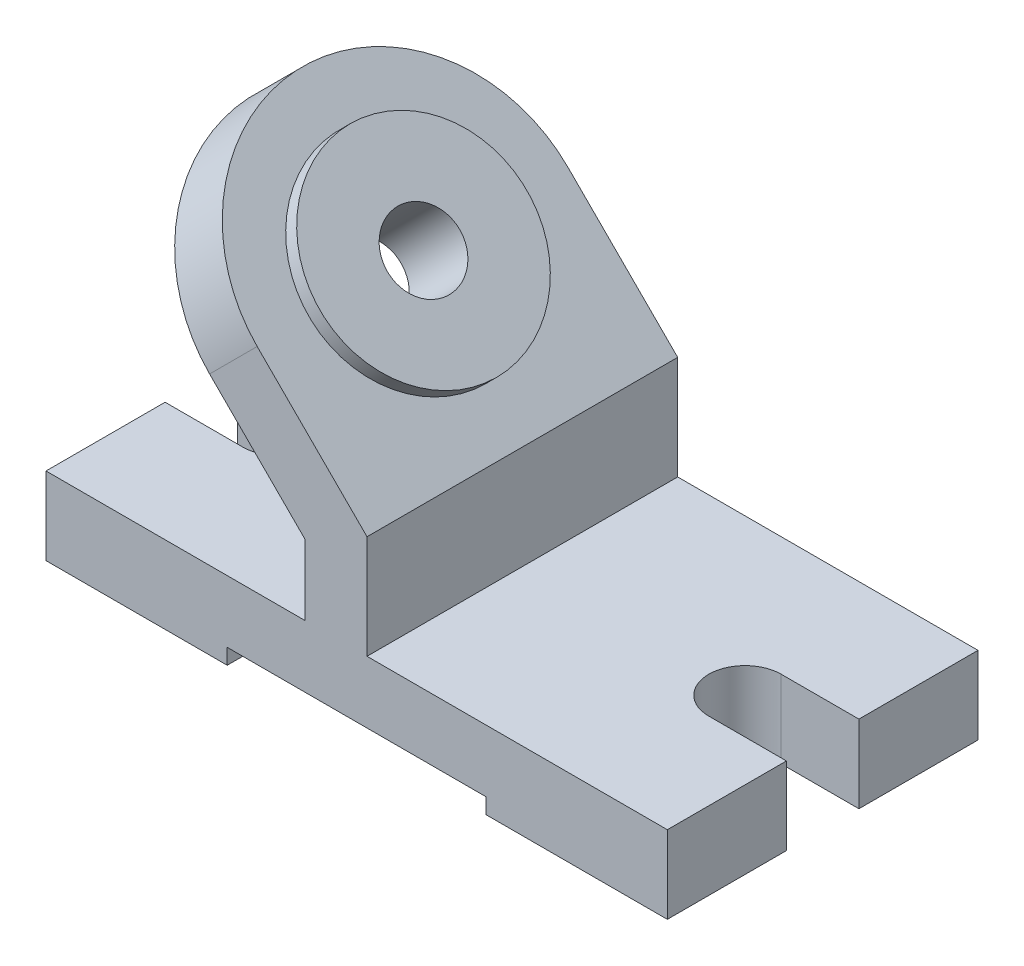
ISO-10303-21;
HEADER;
FILE_DESCRIPTION(('STEP AP214'),'2;1');
FILE_NAME('part.step','',(''),(''),'','','');
FILE_SCHEMA(('AUTOMOTIVE_DESIGN { 1 0 10303 214 1 1 1 1 }'));
ENDSEC;
DATA;
#1=APPLICATION_CONTEXT('core data for automotive mechanical design processes');
#2=APPLICATION_PROTOCOL_DEFINITION('international standard','automotive_design',2000,#1);
#3=PRODUCT_CONTEXT('',#1,'mechanical');
#4=PRODUCT('Part','Part','',(#3));
#5=PRODUCT_RELATED_PRODUCT_CATEGORY('part','',(#4));
#6=PRODUCT_DEFINITION_FORMATION('','',#4);
#7=PRODUCT_DEFINITION_CONTEXT('part definition',#1,'design');
#8=PRODUCT_DEFINITION('design','',#6,#7);
#9=PRODUCT_DEFINITION_SHAPE('','',#8);
#10=(LENGTH_UNIT() NAMED_UNIT(*) SI_UNIT(.MILLI.,.METRE.));
#11=(NAMED_UNIT(*) PLANE_ANGLE_UNIT() SI_UNIT($,.RADIAN.));
#12=(NAMED_UNIT(*) SI_UNIT($,.STERADIAN.) SOLID_ANGLE_UNIT());
#13=UNCERTAINTY_MEASURE_WITH_UNIT(LENGTH_MEASURE(1.E-05),#10,'distance_accuracy_value','');
#14=(GEOMETRIC_REPRESENTATION_CONTEXT(3) GLOBAL_UNCERTAINTY_ASSIGNED_CONTEXT((#13)) GLOBAL_UNIT_ASSIGNED_CONTEXT((#10,
#11,#12)) REPRESENTATION_CONTEXT('',''));
#15=CARTESIAN_POINT('',(0.,0.,0.));
#16=DIRECTION('',(0.,0.,1.));
#17=DIRECTION('',(1.,0.,0.));
#18=AXIS2_PLACEMENT_3D('',#15,#16,#17);
#19=CARTESIAN_POINT('',(-9.99999999999999,12.,30.));
#20=DIRECTION('',(1.,0.,0.));
#21=DIRECTION('',(0.,1.,0.));
#22=AXIS2_PLACEMENT_3D('',#19,#20,#21);
#23=PLANE('',#22);
#24=DIRECTION('',(0.,-1.,0.));
#25=VECTOR('',#24,1.);
#26=CARTESIAN_POINT('',(-9.99999999999999,12.,-5.));
#27=LINE('',#26,#25);
#28=CARTESIAN_POINT('',(-10.,25.6152236891497,-5.));
#29=VERTEX_POINT('',#28);
#30=CARTESIAN_POINT('',(-9.99999999999999,12.,-5.));
#31=VERTEX_POINT('',#30);
#32=EDGE_CURVE('E251',#29,#31,#27,.T.);
#33=ORIENTED_EDGE('',*,*,#32,.F.);
#34=DIRECTION('',(0.,0.,-1.));
#35=VECTOR('',#34,1.);
#36=CARTESIAN_POINT('',(-10.,25.6152236891497,30.));
#37=LINE('',#36,#35);
#38=CARTESIAN_POINT('',(-10.,25.6152236891497,-30.));
#39=VERTEX_POINT('',#38);
#40=EDGE_CURVE('E234',#29,#39,#37,.T.);
#41=ORIENTED_EDGE('',*,*,#40,.T.);
#42=DIRECTION('',(0.,-1.,0.));
#43=VECTOR('',#42,1.);
#44=CARTESIAN_POINT('',(-9.99999999999999,12.,-30.));
#45=LINE('',#44,#43);
#46=CARTESIAN_POINT('',(-9.99999999999999,12.,-30.));
#47=VERTEX_POINT('',#46);
#48=EDGE_CURVE('E300',#39,#47,#45,.T.);
#49=ORIENTED_EDGE('',*,*,#48,.T.);
#50=DIRECTION('',(0.,0.,-1.));
#51=VECTOR('',#50,1.);
#52=CARTESIAN_POINT('',(-9.99999999999999,12.,30.));
#53=LINE('',#52,#51);
#54=EDGE_CURVE('E252',#31,#47,#53,.T.);
#55=ORIENTED_EDGE('',*,*,#54,.F.);
#56=EDGE_LOOP('',(#33,#41,#49,#55));
#57=FACE_BOUND('',#56,.T.);
#58=ADVANCED_FACE('F62',(#57),#23,.F.);
#59=CARTESIAN_POINT('',(-60.,12.,30.));
#60=DIRECTION('',(0.,-1.,0.));
#61=DIRECTION('',(0.,0.,-1.));
#62=AXIS2_PLACEMENT_3D('',#59,#60,#61);
#63=PLANE('',#62);
#64=DIRECTION('',(1.,0.,0.));
#65=VECTOR('',#64,1.);
#66=CARTESIAN_POINT('',(75.,12.,6.99999999999997));
#67=LINE('',#66,#65);
#68=CARTESIAN_POINT('',(45.,12.,6.99999999999997));
#69=VERTEX_POINT('',#68);
#70=CARTESIAN_POINT('',(60.,12.,6.99999999999997));
#71=VERTEX_POINT('',#70);
#72=EDGE_CURVE('E352',#69,#71,#67,.T.);
#73=ORIENTED_EDGE('',*,*,#72,.F.);
#74=CARTESIAN_POINT('',(45.,12.,0.));
#75=DIRECTION('',(0.,1.,0.));
#76=DIRECTION('',(0.,0.,1.));
#77=AXIS2_PLACEMENT_3D('',#74,#75,#76);
#78=CIRCLE('',#77,6.99999999999996);
#79=CARTESIAN_POINT('',(45.,12.,-6.99999999999994));
#80=VERTEX_POINT('',#79);
#81=EDGE_CURVE('E360',#80,#69,#78,.T.);
#82=ORIENTED_EDGE('',*,*,#81,.F.);
#83=DIRECTION('',(-1.,0.,0.));
#84=VECTOR('',#83,1.);
#85=CARTESIAN_POINT('',(75.,12.,-6.99999999999994));
#86=LINE('',#85,#84);
#87=CARTESIAN_POINT('',(60.,12.,-6.99999999999994));
#88=VERTEX_POINT('',#87);
#89=EDGE_CURVE('E357',#88,#80,#86,.T.);
#90=ORIENTED_EDGE('',*,*,#89,.F.);
#91=DIRECTION('',(0.,0.,-1.));
#92=VECTOR('',#91,1.);
#93=CARTESIAN_POINT('',(60.,12.,30.));
#94=LINE('',#93,#92);
#95=CARTESIAN_POINT('',(60.,12.,-30.));
#96=VERTEX_POINT('',#95);
#97=EDGE_CURVE('E498',#88,#96,#94,.T.);
#98=ORIENTED_EDGE('',*,*,#97,.T.);
#99=DIRECTION('',(-1.,0.,0.));
#100=VECTOR('',#99,1.);
#101=CARTESIAN_POINT('',(-60.,12.,-30.));
#102=LINE('',#101,#100);
#103=CARTESIAN_POINT('',(2.00000000000001,12.,-30.));
#104=VERTEX_POINT('',#103);
#105=EDGE_CURVE('E445',#96,#104,#102,.T.);
#106=ORIENTED_EDGE('',*,*,#105,.T.);
#107=DIRECTION('',(0.,0.,-1.));
#108=VECTOR('',#107,1.);
#109=CARTESIAN_POINT('',(2.00000000000001,12.,30.));
#110=LINE('',#109,#108);
#111=CARTESIAN_POINT('',(2.00000000000001,12.,30.));
#112=VERTEX_POINT('',#111);
#113=EDGE_CURVE('E341',#112,#104,#110,.T.);
#114=ORIENTED_EDGE('',*,*,#113,.F.);
#115=DIRECTION('',(-1.,0.,0.));
#116=VECTOR('',#115,1.);
#117=CARTESIAN_POINT('',(-60.,12.,30.));
#118=LINE('',#117,#116);
#119=CARTESIAN_POINT('',(60.,12.,30.));
#120=VERTEX_POINT('',#119);
#121=EDGE_CURVE('E418',#120,#112,#118,.T.);
#122=ORIENTED_EDGE('',*,*,#121,.F.);
#123=EDGE_CURVE('E499',#120,#71,#94,.T.);
#124=ORIENTED_EDGE('',*,*,#123,.T.);
#125=EDGE_LOOP('',(#73,#82,#90,#98,#106,#114,#122,#124));
#126=FACE_BOUND('',#125,.T.);
#127=ADVANCED_FACE('F587',(#126),#63,.F.);
#128=CARTESIAN_POINT('',(60.,-2.99999999999999,30.));
#129=DIRECTION('',(-1.,0.,0.));
#130=DIRECTION('',(0.,0.,1.));
#131=AXIS2_PLACEMENT_3D('',#128,#129,#130);
#132=PLANE('',#131);
#133=DIRECTION('',(0.,0.,-1.));
#134=VECTOR('',#133,1.);
#135=CARTESIAN_POINT('',(60.,-2.99999999999999,30.));
#136=LINE('',#135,#134);
#137=CARTESIAN_POINT('',(60.,-2.99999999999999,30.));
#138=VERTEX_POINT('',#137);
#139=CARTESIAN_POINT('',(60.,-2.99999999999999,6.99999999999997));
#140=VERTEX_POINT('',#139);
#141=EDGE_CURVE('E472',#138,#140,#136,.T.);
#142=ORIENTED_EDGE('',*,*,#141,.T.);
#143=DIRECTION('',(0.,1.,0.));
#144=VECTOR('',#143,1.);
#145=CARTESIAN_POINT('',(60.,-2.99999999999999,6.99999999999998));
#146=LINE('',#145,#144);
#147=EDGE_CURVE('E399',#140,#71,#146,.T.);
#148=ORIENTED_EDGE('',*,*,#147,.T.);
#149=ORIENTED_EDGE('',*,*,#123,.F.);
#150=DIRECTION('',(0.,1.,0.));
#151=VECTOR('',#150,1.);
#152=CARTESIAN_POINT('',(60.,-2.99999999999999,30.));
#153=LINE('',#152,#151);
#154=EDGE_CURVE('E412',#138,#120,#153,.T.);
#155=ORIENTED_EDGE('',*,*,#154,.F.);
#156=EDGE_LOOP('',(#142,#148,#149,#155));
#157=FACE_BOUND('',#156,.T.);
#158=ADVANCED_FACE('F593',(#157),#132,.F.);
#159=CARTESIAN_POINT('',(-60.,-2.99999999999999,30.));
#160=DIRECTION('',(1.,0.,0.));
#161=DIRECTION('',(0.,0.,-1.));
#162=AXIS2_PLACEMENT_3D('',#159,#160,#161);
#163=PLANE('',#162);
#164=DIRECTION('',(0.,0.,-1.));
#165=VECTOR('',#164,1.);
#166=CARTESIAN_POINT('',(-60.,-2.99999999999999,30.));
#167=LINE('',#166,#165);
#168=CARTESIAN_POINT('',(-60.,-2.99999999999999,-6.99999999999994));
#169=VERTEX_POINT('',#168);
#170=CARTESIAN_POINT('',(-60.,-2.99999999999999,-30.));
#171=VERTEX_POINT('',#170);
#172=EDGE_CURVE('E488',#169,#171,#167,.T.);
#173=ORIENTED_EDGE('',*,*,#172,.F.);
#174=DIRECTION('',(0.,1.,0.));
#175=VECTOR('',#174,1.);
#176=CARTESIAN_POINT('',(-60.,-2.99999999999999,-6.99999999999994));
#177=LINE('',#176,#175);
#178=CARTESIAN_POINT('',(-60.,12.,-6.99999999999994));
#179=VERTEX_POINT('',#178);
#180=EDGE_CURVE('E407',#169,#179,#177,.T.);
#181=ORIENTED_EDGE('',*,*,#180,.T.);
#182=DIRECTION('',(0.,0.,-1.));
#183=VECTOR('',#182,1.);
#184=CARTESIAN_POINT('',(-60.,12.,30.));
#185=LINE('',#184,#183);
#186=CARTESIAN_POINT('',(-60.,12.,-30.));
#187=VERTEX_POINT('',#186);
#188=EDGE_CURVE('E493',#179,#187,#185,.T.);
#189=ORIENTED_EDGE('',*,*,#188,.T.);
#190=DIRECTION('',(0.,-1.,0.));
#191=VECTOR('',#190,1.);
#192=CARTESIAN_POINT('',(-60.,-2.99999999999999,-30.));
#193=LINE('',#192,#191);
#194=EDGE_CURVE('E449',#187,#171,#193,.T.);
#195=ORIENTED_EDGE('',*,*,#194,.T.);
#196=EDGE_LOOP('',(#173,#181,#189,#195));
#197=FACE_BOUND('',#196,.T.);
#198=ADVANCED_FACE('F532',(#197),#163,.F.);
#199=ORIENTED_EDGE('',*,*,#97,.F.);
#200=DIRECTION('',(0.,-1.,0.));
#201=VECTOR('',#200,1.);
#202=CARTESIAN_POINT('',(60.,-2.99999999999999,-6.99999999999994));
#203=LINE('',#202,#201);
#204=CARTESIAN_POINT('',(60.,-2.99999999999999,-6.99999999999994));
#205=VERTEX_POINT('',#204);
#206=EDGE_CURVE('E370',#88,#205,#203,.T.);
#207=ORIENTED_EDGE('',*,*,#206,.T.);
#208=CARTESIAN_POINT('',(60.,-2.99999999999999,-30.));
#209=VERTEX_POINT('',#208);
#210=EDGE_CURVE('E440',#205,#209,#136,.T.);
#211=ORIENTED_EDGE('',*,*,#210,.T.);
#212=DIRECTION('',(0.,1.,0.));
#213=VECTOR('',#212,1.);
#214=CARTESIAN_POINT('',(60.,-2.99999999999999,-30.));
#215=LINE('',#214,#213);
#216=EDGE_CURVE('E411',#209,#96,#215,.T.);
#217=ORIENTED_EDGE('',*,*,#216,.T.);
#218=EDGE_LOOP('',(#199,#207,#211,#217));
#219=FACE_BOUND('',#218,.T.);
#220=ADVANCED_FACE('F64',(#219),#132,.F.);
#221=CARTESIAN_POINT('',(-9.99999999999999,12.,30.));
#222=VERTEX_POINT('',#221);
#223=CARTESIAN_POINT('',(-9.99999999999999,12.,5.));
#224=VERTEX_POINT('',#223);
#225=EDGE_CURVE('E344',#222,#224,#53,.T.);
#226=ORIENTED_EDGE('',*,*,#225,.T.);
#227=DIRECTION('',(-1.,0.,0.));
#228=VECTOR('',#227,1.);
#229=CARTESIAN_POINT('',(-60.,12.,5.));
#230=LINE('',#229,#228);
#231=CARTESIAN_POINT('',(-35.,12.,5.));
#232=VERTEX_POINT('',#231);
#233=EDGE_CURVE('E78',#224,#232,#230,.T.);
#234=ORIENTED_EDGE('',*,*,#233,.T.);
#235=DIRECTION('',(0.,0.,-1.));
#236=VECTOR('',#235,1.);
#237=CARTESIAN_POINT('',(-35.,12.,30.));
#238=LINE('',#237,#236);
#239=CARTESIAN_POINT('',(-35.,12.,-5.));
#240=VERTEX_POINT('',#239);
#241=EDGE_CURVE('E82',#232,#240,#238,.T.);
#242=ORIENTED_EDGE('',*,*,#241,.T.);
#243=DIRECTION('',(-1.,0.,0.));
#244=VECTOR('',#243,1.);
#245=CARTESIAN_POINT('',(-60.,12.,-5.));
#246=LINE('',#245,#244);
#247=EDGE_CURVE('E255',#31,#240,#246,.T.);
#248=ORIENTED_EDGE('',*,*,#247,.F.);
#249=ORIENTED_EDGE('',*,*,#54,.T.);
#250=EDGE_CURVE('E444',#47,#187,#102,.T.);
#251=ORIENTED_EDGE('',*,*,#250,.T.);
#252=ORIENTED_EDGE('',*,*,#188,.F.);
#253=DIRECTION('',(-1.,0.,0.));
#254=VECTOR('',#253,1.);
#255=CARTESIAN_POINT('',(-75.,12.,-6.99999999999994));
#256=LINE('',#255,#254);
#257=CARTESIAN_POINT('',(-45.,12.,-6.99999999999994));
#258=VERTEX_POINT('',#257);
#259=EDGE_CURVE('E381',#258,#179,#256,.T.);
#260=ORIENTED_EDGE('',*,*,#259,.F.);
#261=CARTESIAN_POINT('',(-45.,12.,0.));
#262=DIRECTION('',(0.,1.,0.));
#263=DIRECTION('',(0.,0.,-1.));
#264=AXIS2_PLACEMENT_3D('',#261,#262,#263);
#265=CIRCLE('',#264,6.99999999999996);
#266=CARTESIAN_POINT('',(-45.,12.,6.99999999999997));
#267=VERTEX_POINT('',#266);
#268=EDGE_CURVE('E384',#267,#258,#265,.T.);
#269=ORIENTED_EDGE('',*,*,#268,.F.);
#270=DIRECTION('',(1.,0.,0.));
#271=VECTOR('',#270,1.);
#272=CARTESIAN_POINT('',(-75.,12.,6.99999999999997));
#273=LINE('',#272,#271);
#274=CARTESIAN_POINT('',(-60.,12.,6.99999999999997));
#275=VERTEX_POINT('',#274);
#276=EDGE_CURVE('E361',#275,#267,#273,.T.);
#277=ORIENTED_EDGE('',*,*,#276,.F.);
#278=CARTESIAN_POINT('',(-60.,12.,30.));
#279=VERTEX_POINT('',#278);
#280=EDGE_CURVE('E494',#279,#275,#185,.T.);
#281=ORIENTED_EDGE('',*,*,#280,.F.);
#282=EDGE_CURVE('E416',#222,#279,#118,.T.);
#283=ORIENTED_EDGE('',*,*,#282,.F.);
#284=EDGE_LOOP('',(#226,#234,#242,#248,#249,#251,#252,#260,#269,#277,#281,#283));
#285=FACE_BOUND('',#284,.T.);
#286=ADVANCED_FACE('F522',(#285),#63,.F.);
#287=ORIENTED_EDGE('',*,*,#280,.T.);
#288=DIRECTION('',(0.,-1.,0.));
#289=VECTOR('',#288,1.);
#290=CARTESIAN_POINT('',(-60.,-2.99999999999999,6.99999999999998));
#291=LINE('',#290,#289);
#292=CARTESIAN_POINT('',(-60.,-2.99999999999999,6.99999999999997));
#293=VERTEX_POINT('',#292);
#294=EDGE_CURVE('E403',#275,#293,#291,.T.);
#295=ORIENTED_EDGE('',*,*,#294,.T.);
#296=CARTESIAN_POINT('',(-60.,-2.99999999999999,30.));
#297=VERTEX_POINT('',#296);
#298=EDGE_CURVE('E489',#297,#293,#167,.T.);
#299=ORIENTED_EDGE('',*,*,#298,.F.);
#300=DIRECTION('',(0.,-1.,0.));
#301=VECTOR('',#300,1.);
#302=CARTESIAN_POINT('',(-60.,-2.99999999999999,30.));
#303=LINE('',#302,#301);
#304=EDGE_CURVE('E422',#279,#297,#303,.T.);
#305=ORIENTED_EDGE('',*,*,#304,.F.);
#306=EDGE_LOOP('',(#287,#295,#299,#305));
#307=FACE_BOUND('',#306,.T.);
#308=ADVANCED_FACE('F518',(#307),#163,.F.);
#309=CARTESIAN_POINT('',(-60.,-2.99999999999999,30.));
#310=DIRECTION('',(0.,1.,0.));
#311=DIRECTION('',(-1.,0.,0.));
#312=AXIS2_PLACEMENT_3D('',#309,#310,#311);
#313=PLANE('',#312);
#314=CARTESIAN_POINT('',(-45.,-2.99999999999999,0.));
#315=DIRECTION('',(0.,1.,0.));
#316=DIRECTION('',(0.,0.,-1.));
#317=AXIS2_PLACEMENT_3D('',#314,#315,#316);
#318=CIRCLE('',#317,6.99999999999996);
#319=CARTESIAN_POINT('',(-45.,-2.99999999999999,6.99999999999998));
#320=VERTEX_POINT('',#319);
#321=CARTESIAN_POINT('',(-45.,-2.99999999999999,-6.99999999999994));
#322=VERTEX_POINT('',#321);
#323=EDGE_CURVE('E385',#320,#322,#318,.T.);
#324=ORIENTED_EDGE('',*,*,#323,.T.);
#325=DIRECTION('',(-1.,0.,0.));
#326=VECTOR('',#325,1.);
#327=CARTESIAN_POINT('',(-75.,-2.99999999999999,-6.99999999999994));
#328=LINE('',#327,#326);
#329=EDGE_CURVE('E378',#322,#169,#328,.T.);
#330=ORIENTED_EDGE('',*,*,#329,.T.);
#331=ORIENTED_EDGE('',*,*,#172,.T.);
#332=DIRECTION('',(1.,0.,0.));
#333=VECTOR('',#332,1.);
#334=CARTESIAN_POINT('',(-60.,-2.99999999999999,-30.));
#335=LINE('',#334,#333);
#336=CARTESIAN_POINT('',(-25.,-2.99999999999999,-30.));
#337=VERTEX_POINT('',#336);
#338=EDGE_CURVE('E453',#171,#337,#335,.T.);
#339=ORIENTED_EDGE('',*,*,#338,.T.);
#340=DIRECTION('',(0.,0.,-1.));
#341=VECTOR('',#340,1.);
#342=CARTESIAN_POINT('',(-25.,-2.99999999999999,30.));
#343=LINE('',#342,#341);
#344=CARTESIAN_POINT('',(-25.,-2.99999999999999,30.));
#345=VERTEX_POINT('',#344);
#346=EDGE_CURVE('E485',#345,#337,#343,.T.);
#347=ORIENTED_EDGE('',*,*,#346,.F.);
#348=DIRECTION('',(1.,0.,0.));
#349=VECTOR('',#348,1.);
#350=CARTESIAN_POINT('',(-60.,-2.99999999999999,30.));
#351=LINE('',#350,#349);
#352=EDGE_CURVE('E425',#297,#345,#351,.T.);
#353=ORIENTED_EDGE('',*,*,#352,.F.);
#354=ORIENTED_EDGE('',*,*,#298,.T.);
#355=DIRECTION('',(1.,0.,0.));
#356=VECTOR('',#355,1.);
#357=CARTESIAN_POINT('',(-60.,-2.99999999999999,6.99999999999998));
#358=LINE('',#357,#356);
#359=EDGE_CURVE('E71',#293,#320,#358,.T.);
#360=ORIENTED_EDGE('',*,*,#359,.T.);
#361=EDGE_LOOP('',(#324,#330,#331,#339,#347,#353,#354,#360));
#362=FACE_BOUND('',#361,.T.);
#363=ADVANCED_FACE('F509',(#362),#313,.F.);
#364=CARTESIAN_POINT('',(-25.,0.,30.));
#365=DIRECTION('',(-1.,0.,0.));
#366=DIRECTION('',(0.,0.,1.));
#367=AXIS2_PLACEMENT_3D('',#364,#365,#366);
#368=PLANE('',#367);
#369=ORIENTED_EDGE('',*,*,#346,.T.);
#370=DIRECTION('',(0.,1.,0.));
#371=VECTOR('',#370,1.);
#372=CARTESIAN_POINT('',(-25.,0.,-30.));
#373=LINE('',#372,#371);
#374=CARTESIAN_POINT('',(-25.,0.,-30.));
#375=VERTEX_POINT('',#374);
#376=EDGE_CURVE('E457',#337,#375,#373,.T.);
#377=ORIENTED_EDGE('',*,*,#376,.T.);
#378=DIRECTION('',(0.,0.,-1.));
#379=VECTOR('',#378,1.);
#380=CARTESIAN_POINT('',(-25.,0.,30.));
#381=LINE('',#380,#379);
#382=CARTESIAN_POINT('',(-25.,0.,30.));
#383=VERTEX_POINT('',#382);
#384=EDGE_CURVE('E482',#383,#375,#381,.T.);
#385=ORIENTED_EDGE('',*,*,#384,.F.);
#386=DIRECTION('',(0.,1.,0.));
#387=VECTOR('',#386,1.);
#388=CARTESIAN_POINT('',(-25.,0.,30.));
#389=LINE('',#388,#387);
#390=EDGE_CURVE('E428',#345,#383,#389,.T.);
#391=ORIENTED_EDGE('',*,*,#390,.F.);
#392=EDGE_LOOP('',(#369,#377,#385,#391));
#393=FACE_BOUND('',#392,.T.);
#394=ADVANCED_FACE('F553',(#393),#368,.F.);
#395=CARTESIAN_POINT('',(-25.,0.,30.));
#396=DIRECTION('',(0.,1.,0.));
#397=DIRECTION('',(0.,0.,1.));
#398=AXIS2_PLACEMENT_3D('',#395,#396,#397);
#399=PLANE('',#398);
#400=ORIENTED_EDGE('',*,*,#384,.T.);
#401=DIRECTION('',(1.,0.,0.));
#402=VECTOR('',#401,1.);
#403=CARTESIAN_POINT('',(-25.,0.,-30.));
#404=LINE('',#403,#402);
#405=CARTESIAN_POINT('',(25.,0.,-30.));
#406=VERTEX_POINT('',#405);
#407=EDGE_CURVE('E461',#375,#406,#404,.T.);
#408=ORIENTED_EDGE('',*,*,#407,.T.);
#409=DIRECTION('',(0.,0.,-1.));
#410=VECTOR('',#409,1.);
#411=CARTESIAN_POINT('',(25.,0.,30.));
#412=LINE('',#411,#410);
#413=CARTESIAN_POINT('',(25.,0.,30.));
#414=VERTEX_POINT('',#413);
#415=EDGE_CURVE('E479',#414,#406,#412,.T.);
#416=ORIENTED_EDGE('',*,*,#415,.F.);
#417=DIRECTION('',(1.,0.,0.));
#418=VECTOR('',#417,1.);
#419=CARTESIAN_POINT('',(-25.,0.,30.));
#420=LINE('',#419,#418);
#421=EDGE_CURVE('E431',#383,#414,#420,.T.);
#422=ORIENTED_EDGE('',*,*,#421,.F.);
#423=EDGE_LOOP('',(#400,#408,#416,#422));
#424=FACE_BOUND('',#423,.T.);
#425=ADVANCED_FACE('F618',(#424),#399,.F.);
#426=CARTESIAN_POINT('',(25.,0.,30.));
#427=DIRECTION('',(1.,0.,0.));
#428=DIRECTION('',(0.,0.,-1.));
#429=AXIS2_PLACEMENT_3D('',#426,#427,#428);
#430=PLANE('',#429);
#431=ORIENTED_EDGE('',*,*,#415,.T.);
#432=DIRECTION('',(0.,-1.,0.));
#433=VECTOR('',#432,1.);
#434=CARTESIAN_POINT('',(25.,0.,-30.));
#435=LINE('',#434,#433);
#436=CARTESIAN_POINT('',(25.,-2.99999999999999,-30.));
#437=VERTEX_POINT('',#436);
#438=EDGE_CURVE('E465',#406,#437,#435,.T.);
#439=ORIENTED_EDGE('',*,*,#438,.T.);
#440=DIRECTION('',(0.,0.,-1.));
#441=VECTOR('',#440,1.);
#442=CARTESIAN_POINT('',(25.,-2.99999999999999,30.));
#443=LINE('',#442,#441);
#444=CARTESIAN_POINT('',(25.,-2.99999999999999,30.));
#445=VERTEX_POINT('',#444);
#446=EDGE_CURVE('E476',#445,#437,#443,.T.);
#447=ORIENTED_EDGE('',*,*,#446,.F.);
#448=DIRECTION('',(0.,-1.,0.));
#449=VECTOR('',#448,1.);
#450=CARTESIAN_POINT('',(25.,0.,30.));
#451=LINE('',#450,#449);
#452=EDGE_CURVE('E434',#414,#445,#451,.T.);
#453=ORIENTED_EDGE('',*,*,#452,.F.);
#454=EDGE_LOOP('',(#431,#439,#447,#453));
#455=FACE_BOUND('',#454,.T.);
#456=ADVANCED_FACE('F615',(#455),#430,.F.);
#457=CARTESIAN_POINT('',(60.,-2.99999999999999,30.));
#458=DIRECTION('',(0.,1.,0.));
#459=DIRECTION('',(-1.,0.,0.));
#460=AXIS2_PLACEMENT_3D('',#457,#458,#459);
#461=PLANE('',#460);
#462=ORIENTED_EDGE('',*,*,#446,.T.);
#463=DIRECTION('',(1.,0.,0.));
#464=VECTOR('',#463,1.);
#465=CARTESIAN_POINT('',(60.,-2.99999999999999,-30.));
#466=LINE('',#465,#464);
#467=EDGE_CURVE('E417',#437,#209,#466,.T.);
#468=ORIENTED_EDGE('',*,*,#467,.T.);
#469=ORIENTED_EDGE('',*,*,#210,.F.);
#470=DIRECTION('',(-1.,0.,0.));
#471=VECTOR('',#470,1.);
#472=CARTESIAN_POINT('',(60.,-2.99999999999999,-6.99999999999994));
#473=LINE('',#472,#471);
#474=CARTESIAN_POINT('',(45.,-2.99999999999999,-6.99999999999994));
#475=VERTEX_POINT('',#474);
#476=EDGE_CURVE('E503',#205,#475,#473,.T.);
#477=ORIENTED_EDGE('',*,*,#476,.T.);
#478=CARTESIAN_POINT('',(45.,-2.99999999999999,0.));
#479=DIRECTION('',(0.,1.,0.));
#480=DIRECTION('',(0.,0.,1.));
#481=AXIS2_PLACEMENT_3D('',#478,#479,#480);
#482=CIRCLE('',#481,6.99999999999996);
#483=CARTESIAN_POINT('',(45.,-2.99999999999999,6.99999999999997));
#484=VERTEX_POINT('',#483);
#485=EDGE_CURVE('E348',#475,#484,#482,.T.);
#486=ORIENTED_EDGE('',*,*,#485,.T.);
#487=DIRECTION('',(1.,0.,0.));
#488=VECTOR('',#487,1.);
#489=CARTESIAN_POINT('',(75.,-2.99999999999999,6.99999999999997));
#490=LINE('',#489,#488);
#491=EDGE_CURVE('E351',#484,#140,#490,.T.);
#492=ORIENTED_EDGE('',*,*,#491,.T.);
#493=ORIENTED_EDGE('',*,*,#141,.F.);
#494=DIRECTION('',(1.,0.,0.));
#495=VECTOR('',#494,1.);
#496=CARTESIAN_POINT('',(60.,-2.99999999999999,30.));
#497=LINE('',#496,#495);
#498=EDGE_CURVE('E437',#445,#138,#497,.T.);
#499=ORIENTED_EDGE('',*,*,#498,.F.);
#500=EDGE_LOOP('',(#462,#468,#469,#477,#486,#492,#493,#499));
#501=FACE_BOUND('',#500,.T.);
#502=ADVANCED_FACE('F607',(#501),#461,.F.);
#503=CARTESIAN_POINT('',(0.,0.,30.));
#504=DIRECTION('',(0.,0.,-1.));
#505=DIRECTION('',(-1.,0.,0.));
#506=AXIS2_PLACEMENT_3D('',#503,#504,#505);
#507=PLANE('',#506);
#508=ORIENTED_EDGE('',*,*,#154,.T.);
#509=ORIENTED_EDGE('',*,*,#121,.T.);
#510=DIRECTION('',(0.,1.,0.));
#511=VECTOR('',#510,1.);
#512=CARTESIAN_POINT('',(2.00000000000001,12.,30.));
#513=LINE('',#512,#511);
#514=CARTESIAN_POINT('',(2.00000000000001,32.,30.));
#515=VERTEX_POINT('',#514);
#516=EDGE_CURVE('E307',#112,#515,#513,.T.);
#517=ORIENTED_EDGE('',*,*,#516,.T.);
#518=DIRECTION('',(-0.707106781186547,0.707106781186548,0.));
#519=VECTOR('',#518,1.);
#520=CARTESIAN_POINT('',(2.00000000000001,32.,30.));
#521=LINE('',#520,#519);
#522=CARTESIAN_POINT('',(-19.2132034355964,53.2132034355965,30.));
#523=VERTEX_POINT('',#522);
#524=EDGE_CURVE('E310',#515,#523,#521,.T.);
#525=ORIENTED_EDGE('',*,*,#524,.T.);
#526=DIRECTION('',(-0.707106781186548,-0.707106781186547,0.));
#527=VECTOR('',#526,1.);
#528=CARTESIAN_POINT('',(-19.2132034355964,53.2132034355964,30.));
#529=LINE('',#528,#527);
#530=CARTESIAN_POINT('',(-28.4055915910215,44.0208152801714,30.));
#531=VERTEX_POINT('',#530);
#532=EDGE_CURVE('E314',#523,#531,#529,.T.);
#533=ORIENTED_EDGE('',*,*,#532,.T.);
#534=DIRECTION('',(0.707106781186546,-0.707106781186549,0.));
#535=VECTOR('',#534,1.);
#536=CARTESIAN_POINT('',(-10.,25.6152236891497,30.));
#537=LINE('',#536,#535);
#538=CARTESIAN_POINT('',(-10.,25.6152236891497,30.));
#539=VERTEX_POINT('',#538);
#540=EDGE_CURVE('E247',#531,#539,#537,.T.);
#541=ORIENTED_EDGE('',*,*,#540,.T.);
#542=DIRECTION('',(0.,-1.,0.));
#543=VECTOR('',#542,1.);
#544=CARTESIAN_POINT('',(-9.99999999999999,12.,30.));
#545=LINE('',#544,#543);
#546=EDGE_CURVE('E304',#539,#222,#545,.T.);
#547=ORIENTED_EDGE('',*,*,#546,.T.);
#548=ORIENTED_EDGE('',*,*,#282,.T.);
#549=ORIENTED_EDGE('',*,*,#304,.T.);
#550=ORIENTED_EDGE('',*,*,#352,.T.);
#551=ORIENTED_EDGE('',*,*,#390,.T.);
#552=ORIENTED_EDGE('',*,*,#421,.T.);
#553=ORIENTED_EDGE('',*,*,#452,.T.);
#554=ORIENTED_EDGE('',*,*,#498,.T.);
#555=EDGE_LOOP('',(#508,#509,#517,#525,#533,#541,#547,#548,#549,#550,#551,#552,#553,#554));
#556=FACE_BOUND('',#555,.T.);
#557=ADVANCED_FACE('F556',(#556),#507,.F.);
#558=CARTESIAN_POINT('',(0.,0.,-30.));
#559=DIRECTION('',(0.,0.,-1.));
#560=DIRECTION('',(-1.,0.,0.));
#561=AXIS2_PLACEMENT_3D('',#558,#559,#560);
#562=PLANE('',#561);
#563=ORIENTED_EDGE('',*,*,#216,.F.);
#564=ORIENTED_EDGE('',*,*,#467,.F.);
#565=ORIENTED_EDGE('',*,*,#438,.F.);
#566=ORIENTED_EDGE('',*,*,#407,.F.);
#567=ORIENTED_EDGE('',*,*,#376,.F.);
#568=ORIENTED_EDGE('',*,*,#338,.F.);
#569=ORIENTED_EDGE('',*,*,#194,.F.);
#570=ORIENTED_EDGE('',*,*,#250,.F.);
#571=ORIENTED_EDGE('',*,*,#48,.F.);
#572=DIRECTION('',(0.707106781186546,-0.707106781186549,0.));
#573=VECTOR('',#572,1.);
#574=CARTESIAN_POINT('',(-10.,25.6152236891497,-30.));
#575=LINE('',#574,#573);
#576=CARTESIAN_POINT('',(-28.4055915910215,44.0208152801713,-30.));
#577=VERTEX_POINT('',#576);
#578=EDGE_CURVE('E241',#577,#39,#575,.T.);
#579=ORIENTED_EDGE('',*,*,#578,.F.);
#580=DIRECTION('',(-0.707106781186548,-0.707106781186547,0.));
#581=VECTOR('',#580,1.);
#582=CARTESIAN_POINT('',(-19.2132034355964,53.2132034355964,-30.));
#583=LINE('',#582,#581);
#584=CARTESIAN_POINT('',(-19.2132034355964,53.2132034355965,-30.));
#585=VERTEX_POINT('',#584);
#586=EDGE_CURVE('E330',#585,#577,#583,.T.);
#587=ORIENTED_EDGE('',*,*,#586,.F.);
#588=DIRECTION('',(-0.707106781186547,0.707106781186548,0.));
#589=VECTOR('',#588,1.);
#590=CARTESIAN_POINT('',(2.00000000000001,32.,-30.));
#591=LINE('',#590,#589);
#592=CARTESIAN_POINT('',(2.00000000000001,32.,-30.));
#593=VERTEX_POINT('',#592);
#594=EDGE_CURVE('E326',#593,#585,#591,.T.);
#595=ORIENTED_EDGE('',*,*,#594,.F.);
#596=DIRECTION('',(0.,1.,0.));
#597=VECTOR('',#596,1.);
#598=CARTESIAN_POINT('',(2.00000000000001,12.,-30.));
#599=LINE('',#598,#597);
#600=EDGE_CURVE('E322',#104,#593,#599,.T.);
#601=ORIENTED_EDGE('',*,*,#600,.F.);
#602=ORIENTED_EDGE('',*,*,#105,.F.);
#603=EDGE_LOOP('',(#563,#564,#565,#566,#567,#568,#569,#570,#571,#579,#587,#595,#601,#602));
#604=FACE_BOUND('',#603,.T.);
#605=ADVANCED_FACE('F546',(#604),#562,.T.);
#606=CARTESIAN_POINT('',(75.,-2.99999999999999,6.99999999999997));
#607=DIRECTION('',(0.,0.,1.));
#608=DIRECTION('',(1.,0.,0.));
#609=AXIS2_PLACEMENT_3D('',#606,#607,#608);
#610=PLANE('',#609);
#611=ORIENTED_EDGE('',*,*,#491,.F.);
#612=DIRECTION('',(0.,1.,0.));
#613=VECTOR('',#612,1.);
#614=CARTESIAN_POINT('',(45.,-2.99999999999999,6.99999999999997));
#615=LINE('',#614,#613);
#616=EDGE_CURVE('E366',#484,#69,#615,.T.);
#617=ORIENTED_EDGE('',*,*,#616,.T.);
#618=ORIENTED_EDGE('',*,*,#72,.T.);
#619=ORIENTED_EDGE('',*,*,#147,.F.);
#620=EDGE_LOOP('',(#611,#617,#618,#619));
#621=FACE_BOUND('',#620,.T.);
#622=ADVANCED_FACE('F598',(#621),#610,.F.);
#623=CARTESIAN_POINT('',(75.,-2.99999999999999,-6.99999999999994));
#624=DIRECTION('',(0.,0.,-1.));
#625=DIRECTION('',(-1.,0.,0.));
#626=AXIS2_PLACEMENT_3D('',#623,#624,#625);
#627=PLANE('',#626);
#628=ORIENTED_EDGE('',*,*,#89,.T.);
#629=DIRECTION('',(0.,1.,0.));
#630=VECTOR('',#629,1.);
#631=CARTESIAN_POINT('',(45.,-2.99999999999999,-6.99999999999994));
#632=LINE('',#631,#630);
#633=EDGE_CURVE('E356',#475,#80,#632,.T.);
#634=ORIENTED_EDGE('',*,*,#633,.F.);
#635=ORIENTED_EDGE('',*,*,#476,.F.);
#636=ORIENTED_EDGE('',*,*,#206,.F.);
#637=EDGE_LOOP('',(#628,#634,#635,#636));
#638=FACE_BOUND('',#637,.T.);
#639=ADVANCED_FACE('F604',(#638),#627,.F.);
#640=CARTESIAN_POINT('',(45.,-2.99999999999999,0.));
#641=DIRECTION('',(0.,1.,0.));
#642=DIRECTION('',(0.,0.,1.));
#643=AXIS2_PLACEMENT_3D('',#640,#641,#642);
#644=CYLINDRICAL_SURFACE('',#643,6.99999999999996);
#645=ORIENTED_EDGE('',*,*,#616,.F.);
#646=ORIENTED_EDGE('',*,*,#485,.F.);
#647=ORIENTED_EDGE('',*,*,#633,.T.);
#648=ORIENTED_EDGE('',*,*,#81,.T.);
#649=EDGE_LOOP('',(#645,#646,#647,#648));
#650=FACE_BOUND('',#649,.T.);
#651=ADVANCED_FACE('F601',(#650),#644,.F.);
#652=CARTESIAN_POINT('',(-75.,-2.99999999999999,-6.99999999999994));
#653=DIRECTION('',(0.,0.,-1.));
#654=DIRECTION('',(-1.,0.,0.));
#655=AXIS2_PLACEMENT_3D('',#652,#653,#654);
#656=PLANE('',#655);
#657=ORIENTED_EDGE('',*,*,#329,.F.);
#658=DIRECTION('',(0.,1.,0.));
#659=VECTOR('',#658,1.);
#660=CARTESIAN_POINT('',(-45.,-2.99999999999999,-6.99999999999994));
#661=LINE('',#660,#659);
#662=EDGE_CURVE('E347',#322,#258,#661,.T.);
#663=ORIENTED_EDGE('',*,*,#662,.T.);
#664=ORIENTED_EDGE('',*,*,#259,.T.);
#665=ORIENTED_EDGE('',*,*,#180,.F.);
#666=EDGE_LOOP('',(#657,#663,#664,#665));
#667=FACE_BOUND('',#666,.T.);
#668=ADVANCED_FACE('F529',(#667),#656,.F.);
#669=CARTESIAN_POINT('',(-75.,-2.99999999999999,6.99999999999997));
#670=DIRECTION('',(0.,0.,1.));
#671=DIRECTION('',(1.,0.,0.));
#672=AXIS2_PLACEMENT_3D('',#669,#670,#671);
#673=PLANE('',#672);
#674=ORIENTED_EDGE('',*,*,#276,.T.);
#675=DIRECTION('',(0.,1.,0.));
#676=VECTOR('',#675,1.);
#677=CARTESIAN_POINT('',(-45.,-2.99999999999999,6.99999999999997));
#678=LINE('',#677,#676);
#679=EDGE_CURVE('E374',#320,#267,#678,.T.);
#680=ORIENTED_EDGE('',*,*,#679,.F.);
#681=ORIENTED_EDGE('',*,*,#359,.F.);
#682=ORIENTED_EDGE('',*,*,#294,.F.);
#683=EDGE_LOOP('',(#674,#680,#681,#682));
#684=FACE_BOUND('',#683,.T.);
#685=ADVANCED_FACE('F515',(#684),#673,.F.);
#686=CARTESIAN_POINT('',(-45.,-2.99999999999999,0.));
#687=DIRECTION('',(0.,1.,0.));
#688=DIRECTION('',(0.,0.,1.));
#689=AXIS2_PLACEMENT_3D('',#686,#687,#688);
#690=CYLINDRICAL_SURFACE('',#689,6.99999999999996);
#691=ORIENTED_EDGE('',*,*,#662,.F.);
#692=ORIENTED_EDGE('',*,*,#323,.F.);
#693=ORIENTED_EDGE('',*,*,#679,.T.);
#694=ORIENTED_EDGE('',*,*,#268,.T.);
#695=EDGE_LOOP('',(#691,#692,#693,#694));
#696=FACE_BOUND('',#695,.T.);
#697=ADVANCED_FACE('F526',(#696),#690,.F.);
#698=CARTESIAN_POINT('',(-10.,25.6152236891497,5.));
#699=VERTEX_POINT('',#698);
#700=EDGE_CURVE('E246',#539,#699,#37,.T.);
#701=ORIENTED_EDGE('',*,*,#700,.T.);
#702=DIRECTION('',(0.,-1.,0.));
#703=VECTOR('',#702,1.);
#704=CARTESIAN_POINT('',(-9.99999999999999,12.,5.));
#705=LINE('',#704,#703);
#706=EDGE_CURVE('E274',#699,#224,#705,.T.);
#707=ORIENTED_EDGE('',*,*,#706,.T.);
#708=ORIENTED_EDGE('',*,*,#225,.F.);
#709=ORIENTED_EDGE('',*,*,#546,.F.);
#710=EDGE_LOOP('',(#701,#707,#708,#709));
#711=FACE_BOUND('',#710,.T.);
#712=ADVANCED_FACE('F563',(#711),#23,.F.);
#713=CARTESIAN_POINT('',(2.00000000000001,12.,30.));
#714=DIRECTION('',(-1.,0.,0.));
#715=DIRECTION('',(0.,0.,1.));
#716=AXIS2_PLACEMENT_3D('',#713,#714,#715);
#717=PLANE('',#716);
#718=ORIENTED_EDGE('',*,*,#113,.T.);
#719=ORIENTED_EDGE('',*,*,#600,.T.);
#720=DIRECTION('',(0.,0.,-1.));
#721=VECTOR('',#720,1.);
#722=CARTESIAN_POINT('',(2.00000000000001,32.,30.));
#723=LINE('',#722,#721);
#724=EDGE_CURVE('E338',#515,#593,#723,.T.);
#725=ORIENTED_EDGE('',*,*,#724,.F.);
#726=ORIENTED_EDGE('',*,*,#516,.F.);
#727=EDGE_LOOP('',(#718,#719,#725,#726));
#728=FACE_BOUND('',#727,.T.);
#729=ADVANCED_FACE('F583',(#728),#717,.F.);
#730=CARTESIAN_POINT('',(2.00000000000001,32.,30.));
#731=DIRECTION('',(-0.707106781186548,-0.707106781186547,0.));
#732=DIRECTION('',(0.707106781186547,-0.707106781186548,0.));
#733=AXIS2_PLACEMENT_3D('',#730,#731,#732);
#734=PLANE('',#733);
#735=CARTESIAN_POINT('',(-19.2132034355964,53.2132034355965,0.));
#736=DIRECTION('',(-0.707106781186548,-0.707106781186547,0.));
#737=DIRECTION('',(0.707106781186547,-0.707106781186548,0.));
#738=AXIS2_PLACEMENT_3D('',#735,#736,#737);
#739=CIRCLE('',#738,20.);
#740=CARTESIAN_POINT('',(-5.07106781186545,39.0710678118655,0.));
#741=VERTEX_POINT('',#740);
#742=EDGE_CURVE('E12',#741,#741,#739,.F.);
#743=ORIENTED_EDGE('',*,*,#742,.F.);
#744=EDGE_LOOP('',(#743));
#745=FACE_BOUND('',#744,.T.);
#746=ORIENTED_EDGE('',*,*,#724,.T.);
#747=ORIENTED_EDGE('',*,*,#594,.T.);
#748=CARTESIAN_POINT('',(-19.2132034355964,53.2132034355965,0.));
#749=DIRECTION('',(0.707106781186548,0.707106781186547,0.));
#750=DIRECTION('',(-0.707106781186547,0.707106781186548,0.));
#751=AXIS2_PLACEMENT_3D('',#748,#749,#750);
#752=CIRCLE('',#751,30.);
#753=EDGE_CURVE('E296',#585,#523,#752,.T.);
#754=ORIENTED_EDGE('',*,*,#753,.T.);
#755=ORIENTED_EDGE('',*,*,#524,.F.);
#756=EDGE_LOOP('',(#746,#747,#754,#755));
#757=FACE_BOUND('',#756,.T.);
#758=ADVANCED_FACE('F579',(#745,#757),#734,.F.);
#759=CARTESIAN_POINT('',(-10.,25.6152236891497,30.));
#760=DIRECTION('',(0.707106781186549,0.707106781186546,0.));
#761=DIRECTION('',(-0.707106781186546,0.707106781186549,0.));
#762=AXIS2_PLACEMENT_3D('',#759,#760,#761);
#763=PLANE('',#762);
#764=CARTESIAN_POINT('',(-28.4055915910215,44.0208152801714,0.));
#765=DIRECTION('',(0.707106781186549,0.707106781186546,0.));
#766=DIRECTION('',(-0.707106781186546,0.707106781186549,0.));
#767=AXIS2_PLACEMENT_3D('',#764,#765,#766);
#768=CIRCLE('',#767,7.00000000000001);
#769=CARTESIAN_POINT('',(-33.3553390593274,48.9705627484772,0.));
#770=VERTEX_POINT('',#769);
#771=EDGE_CURVE('E284',#770,#770,#768,.F.);
#772=ORIENTED_EDGE('',*,*,#771,.F.);
#773=EDGE_LOOP('',(#772));
#774=FACE_BOUND('',#773,.T.);
#775=DIRECTION('',(0.,0.,1.));
#776=VECTOR('',#775,1.);
#777=CARTESIAN_POINT('',(-20.8658471569526,36.4810708461024,30.));
#778=LINE('',#777,#776);
#779=CARTESIAN_POINT('',(-20.8658471569526,36.4810708461024,-5.));
#780=VERTEX_POINT('',#779);
#781=CARTESIAN_POINT('',(-20.8658471569526,36.4810708461024,5.));
#782=VERTEX_POINT('',#781);
#783=EDGE_CURVE('E279',#780,#782,#778,.T.);
#784=ORIENTED_EDGE('',*,*,#783,.T.);
#785=DIRECTION('',(0.707106781186546,-0.707106781186549,0.));
#786=VECTOR('',#785,1.);
#787=CARTESIAN_POINT('',(-10.,25.6152236891497,5.));
#788=LINE('',#787,#786);
#789=EDGE_CURVE('E271',#782,#699,#788,.T.);
#790=ORIENTED_EDGE('',*,*,#789,.T.);
#791=ORIENTED_EDGE('',*,*,#700,.F.);
#792=ORIENTED_EDGE('',*,*,#540,.F.);
#793=CARTESIAN_POINT('',(-28.4055915910215,44.0208152801714,0.));
#794=DIRECTION('',(0.707106781186549,0.707106781186546,0.));
#795=DIRECTION('',(-0.707106781186546,0.707106781186549,0.));
#796=AXIS2_PLACEMENT_3D('',#793,#794,#795);
#797=CIRCLE('',#796,30.);
#798=EDGE_CURVE('E297',#531,#577,#797,.F.);
#799=ORIENTED_EDGE('',*,*,#798,.T.);
#800=ORIENTED_EDGE('',*,*,#578,.T.);
#801=ORIENTED_EDGE('',*,*,#40,.F.);
#802=DIRECTION('',(0.707106781186546,-0.707106781186549,0.));
#803=VECTOR('',#802,1.);
#804=CARTESIAN_POINT('',(-10.,25.6152236891497,-5.));
#805=LINE('',#804,#803);
#806=EDGE_CURVE('E238',#780,#29,#805,.T.);
#807=ORIENTED_EDGE('',*,*,#806,.F.);
#808=EDGE_LOOP('',(#784,#790,#791,#792,#799,#800,#801,#807));
#809=FACE_BOUND('',#808,.T.);
#810=ADVANCED_FACE('F236',(#774,#809),#763,.F.);
#811=CARTESIAN_POINT('',(-75.8397564935473,-3.41334962235429,0.));
#812=DIRECTION('',(0.707106781186548,0.707106781186547,0.));
#813=DIRECTION('',(-0.707106781186547,0.707106781186548,0.));
#814=AXIS2_PLACEMENT_3D('',#811,#812,#813);
#815=CYLINDRICAL_SURFACE('',#814,30.);
#816=ORIENTED_EDGE('',*,*,#798,.F.);
#817=ORIENTED_EDGE('',*,*,#532,.F.);
#818=ORIENTED_EDGE('',*,*,#753,.F.);
#819=ORIENTED_EDGE('',*,*,#586,.T.);
#820=EDGE_LOOP('',(#816,#817,#818,#819));
#821=FACE_BOUND('',#820,.T.);
#822=ADVANCED_FACE('F574',(#821),#815,.T.);
#823=CARTESIAN_POINT('',(-17.0918830920367,55.3345237791561,0.));
#824=DIRECTION('',(-0.707106781186548,-0.707106781186547,0.));
#825=DIRECTION('',(0.707106781186547,-0.707106781186548,0.));
#826=AXIS2_PLACEMENT_3D('',#823,#824,#825);
#827=CYLINDRICAL_SURFACE('',#826,20.);
#828=CARTESIAN_POINT('',(-17.0918830920367,55.3345237791561,0.));
#829=DIRECTION('',(0.707106781186548,0.707106781186547,0.));
#830=DIRECTION('',(-0.707106781186547,0.707106781186548,0.));
#831=AXIS2_PLACEMENT_3D('',#828,#829,#830);
#832=CIRCLE('',#831,20.);
#833=CARTESIAN_POINT('',(-31.2340187157677,69.4766594028871,0.));
#834=VERTEX_POINT('',#833);
#835=EDGE_CURVE('E288',#834,#834,#832,.T.);
#836=ORIENTED_EDGE('',*,*,#835,.F.);
#837=EDGE_LOOP('',(#836));
#838=FACE_BOUND('',#837,.T.);
#839=ORIENTED_EDGE('',*,*,#742,.T.);
#840=EDGE_LOOP('',(#839));
#841=FACE_BOUND('',#840,.T.);
#842=ADVANCED_FACE('F758',(#838,#841),#827,.T.);
#843=CARTESIAN_POINT('',(-17.0918830920367,55.3345237791561,0.));
#844=DIRECTION('',(-0.707106781186548,-0.707106781186547,0.));
#845=DIRECTION('',(0.707106781186547,-0.707106781186548,0.));
#846=AXIS2_PLACEMENT_3D('',#843,#844,#845);
#847=CYLINDRICAL_SURFACE('',#846,7.);
#848=CARTESIAN_POINT('',(-17.0918830920367,55.3345237791561,0.));
#849=DIRECTION('',(0.707106781186548,0.707106781186547,0.));
#850=DIRECTION('',(-0.707106781186547,0.707106781186548,0.));
#851=AXIS2_PLACEMENT_3D('',#848,#849,#850);
#852=CIRCLE('',#851,7.);
#853=CARTESIAN_POINT('',(-22.0416305603426,60.2842712474619,0.));
#854=VERTEX_POINT('',#853);
#855=EDGE_CURVE('E292',#854,#854,#852,.T.);
#856=ORIENTED_EDGE('',*,*,#855,.T.);
#857=EDGE_LOOP('',(#856));
#858=FACE_BOUND('',#857,.T.);
#859=ORIENTED_EDGE('',*,*,#771,.T.);
#860=EDGE_LOOP('',(#859));
#861=FACE_BOUND('',#860,.T.);
#862=ADVANCED_FACE('F762',(#858,#861),#847,.F.);
#863=CARTESIAN_POINT('',(19.1213203435597,19.1213203435596,0.));
#864=DIRECTION('',(0.707106781186548,0.707106781186547,0.));
#865=DIRECTION('',(-0.707106781186547,0.707106781186548,0.));
#866=AXIS2_PLACEMENT_3D('',#863,#864,#865);
#867=PLANE('',#866);
#868=ORIENTED_EDGE('',*,*,#855,.F.);
#869=EDGE_LOOP('',(#868));
#870=FACE_BOUND('',#869,.T.);
#871=ORIENTED_EDGE('',*,*,#835,.T.);
#872=EDGE_LOOP('',(#871));
#873=FACE_BOUND('',#872,.T.);
#874=ADVANCED_FACE('F772',(#870,#873),#867,.T.);
#875=CARTESIAN_POINT('',(-20.8658471569526,36.4810708461024,0.));
#876=DIRECTION('',(-0.86602540378444,0.499999999999998,0.));
#877=DIRECTION('',(-0.499999999999998,-0.86602540378444,0.));
#878=AXIS2_PLACEMENT_3D('',#875,#876,#877);
#879=PLANE('',#878);
#880=ORIENTED_EDGE('',*,*,#241,.F.);
#881=DIRECTION('',(-0.499999999999998,-0.86602540378444,0.));
#882=VECTOR('',#881,1.);
#883=CARTESIAN_POINT('',(-20.8658471569526,36.4810708461024,5.));
#884=LINE('',#883,#882);
#885=EDGE_CURVE('E262',#782,#232,#884,.T.);
#886=ORIENTED_EDGE('',*,*,#885,.F.);
#887=ORIENTED_EDGE('',*,*,#783,.F.);
#888=DIRECTION('',(-0.499999999999998,-0.86602540378444,0.));
#889=VECTOR('',#888,1.);
#890=CARTESIAN_POINT('',(-20.8658471569526,36.4810708461024,-5.));
#891=LINE('',#890,#889);
#892=EDGE_CURVE('E260',#780,#240,#891,.T.);
#893=ORIENTED_EDGE('',*,*,#892,.T.);
#894=EDGE_LOOP('',(#880,#886,#887,#893));
#895=FACE_BOUND('',#894,.T.);
#896=ADVANCED_FACE('F570',(#895),#879,.T.);
#897=CARTESIAN_POINT('',(0.,35.7132034355965,5.));
#898=DIRECTION('',(0.,0.,1.));
#899=DIRECTION('',(1.,0.,0.));
#900=AXIS2_PLACEMENT_3D('',#897,#898,#899);
#901=PLANE('',#900);
#902=ORIENTED_EDGE('',*,*,#233,.F.);
#903=ORIENTED_EDGE('',*,*,#706,.F.);
#904=ORIENTED_EDGE('',*,*,#789,.F.);
#905=ORIENTED_EDGE('',*,*,#885,.T.);
#906=EDGE_LOOP('',(#902,#903,#904,#905));
#907=FACE_BOUND('',#906,.T.);
#908=ADVANCED_FACE('F566',(#907),#901,.T.);
#909=CARTESIAN_POINT('',(0.,35.7132034355965,-5.));
#910=DIRECTION('',(0.,0.,1.));
#911=DIRECTION('',(1.,0.,0.));
#912=AXIS2_PLACEMENT_3D('',#909,#910,#911);
#913=PLANE('',#912);
#914=ORIENTED_EDGE('',*,*,#32,.T.);
#915=ORIENTED_EDGE('',*,*,#247,.T.);
#916=ORIENTED_EDGE('',*,*,#892,.F.);
#917=ORIENTED_EDGE('',*,*,#806,.T.);
#918=EDGE_LOOP('',(#914,#915,#916,#917));
#919=FACE_BOUND('',#918,.T.);
#920=ADVANCED_FACE('F258',(#919),#913,.F.);
#921=CLOSED_SHELL('',(#58,#127,#158,#198,#220,#286,#308,#363,#394,#425,#456,#502,#557,#605,#622,
#639,#651,#668,#685,#697,#712,#729,#758,#810,#822,#842,#862,#874,#896,#908,#920));
#922=MANIFOLD_SOLID_BREP('B2',#921);
#923=ADVANCED_BREP_SHAPE_REPRESENTATION('',(#18,#922),#14);
#924=SHAPE_DEFINITION_REPRESENTATION(#9,#923);
ENDSEC;
END-ISO-10303-21;
